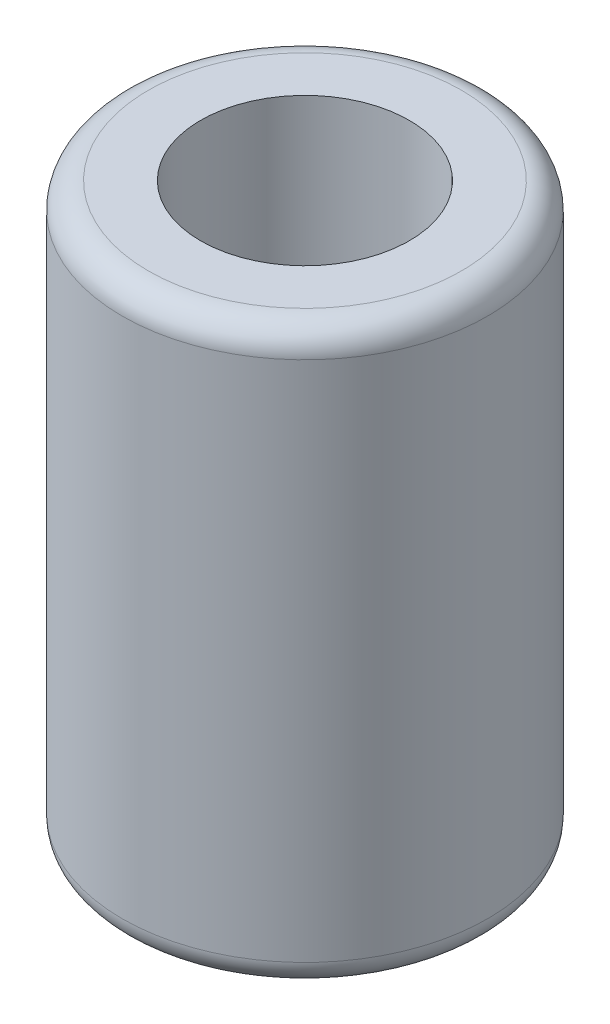
ISO-10303-21;
HEADER;
FILE_DESCRIPTION(('STEP AP214'),'2;1');
FILE_NAME('part.step','',(''),(''),'','','');
FILE_SCHEMA(('AUTOMOTIVE_DESIGN { 1 0 10303 214 1 1 1 1 }'));
ENDSEC;
DATA;
#1=APPLICATION_CONTEXT('core data for automotive mechanical design processes');
#2=APPLICATION_PROTOCOL_DEFINITION('international standard','automotive_design',2000,#1);
#3=PRODUCT_CONTEXT('',#1,'mechanical');
#4=PRODUCT('Part','Part','',(#3));
#5=PRODUCT_RELATED_PRODUCT_CATEGORY('part','',(#4));
#6=PRODUCT_DEFINITION_FORMATION('','',#4);
#7=PRODUCT_DEFINITION_CONTEXT('part definition',#1,'design');
#8=PRODUCT_DEFINITION('design','',#6,#7);
#9=PRODUCT_DEFINITION_SHAPE('','',#8);
#10=(LENGTH_UNIT() NAMED_UNIT(*) SI_UNIT(.MILLI.,.METRE.));
#11=(NAMED_UNIT(*) PLANE_ANGLE_UNIT() SI_UNIT($,.RADIAN.));
#12=(NAMED_UNIT(*) SI_UNIT($,.STERADIAN.) SOLID_ANGLE_UNIT());
#13=UNCERTAINTY_MEASURE_WITH_UNIT(LENGTH_MEASURE(1.E-05),#10,'distance_accuracy_value','');
#14=(GEOMETRIC_REPRESENTATION_CONTEXT(3) GLOBAL_UNCERTAINTY_ASSIGNED_CONTEXT((#13)) GLOBAL_UNIT_ASSIGNED_CONTEXT((#10,
#11,#12)) REPRESENTATION_CONTEXT('',''));
#15=CARTESIAN_POINT('',(0.,0.,0.));
#16=DIRECTION('',(0.,0.,1.));
#17=DIRECTION('',(1.,0.,0.));
#18=AXIS2_PLACEMENT_3D('',#15,#16,#17);
#19=CARTESIAN_POINT('',(0.,22.,0.));
#20=DIRECTION('',(0.,-1.,0.));
#21=DIRECTION('',(0.,0.,-1.));
#22=AXIS2_PLACEMENT_3D('',#19,#20,#21);
#23=CYLINDRICAL_SURFACE('',#22,7.);
#24=CARTESIAN_POINT('',(0.,1.,0.));
#25=DIRECTION('',(0.,1.,0.));
#26=DIRECTION('',(0.,0.,1.));
#27=AXIS2_PLACEMENT_3D('',#24,#25,#26);
#28=CIRCLE('',#27,7.);
#29=CARTESIAN_POINT('',(0.,1.,7.));
#30=VERTEX_POINT('',#29);
#31=EDGE_CURVE('E45',#30,#30,#28,.T.);
#32=ORIENTED_EDGE('',*,*,#31,.T.);
#33=EDGE_LOOP('',(#32));
#34=FACE_BOUND('',#33,.T.);
#35=CARTESIAN_POINT('',(0.,21.,0.));
#36=DIRECTION('',(0.,1.,0.));
#37=DIRECTION('',(0.,0.,1.));
#38=AXIS2_PLACEMENT_3D('',#35,#36,#37);
#39=CIRCLE('',#38,7.);
#40=CARTESIAN_POINT('',(0.,21.,7.));
#41=VERTEX_POINT('',#40);
#42=EDGE_CURVE('E50',#41,#41,#39,.F.);
#43=ORIENTED_EDGE('',*,*,#42,.T.);
#44=EDGE_LOOP('',(#43));
#45=FACE_BOUND('',#44,.T.);
#46=ADVANCED_FACE('F37',(#34,#45),#23,.T.);
#47=CARTESIAN_POINT('',(0.,22.,0.));
#48=DIRECTION('',(0.,1.,0.));
#49=DIRECTION('',(0.,0.,1.));
#50=AXIS2_PLACEMENT_3D('',#47,#48,#49);
#51=PLANE('',#50);
#52=CARTESIAN_POINT('',(0.,22.,0.));
#53=DIRECTION('',(0.,1.,0.));
#54=DIRECTION('',(0.,0.,1.));
#55=AXIS2_PLACEMENT_3D('',#52,#53,#54);
#56=CIRCLE('',#55,6.);
#57=CARTESIAN_POINT('',(0.,22.,6.));
#58=VERTEX_POINT('',#57);
#59=EDGE_CURVE('E55',#58,#58,#56,.T.);
#60=ORIENTED_EDGE('',*,*,#59,.T.);
#61=EDGE_LOOP('',(#60));
#62=FACE_BOUND('',#61,.T.);
#63=CARTESIAN_POINT('',(0.,22.,0.));
#64=DIRECTION('',(0.,1.,0.));
#65=DIRECTION('',(0.,0.,1.));
#66=AXIS2_PLACEMENT_3D('',#63,#64,#65);
#67=CIRCLE('',#66,4.);
#68=CARTESIAN_POINT('',(0.,22.,4.));
#69=VERTEX_POINT('',#68);
#70=EDGE_CURVE('E62',#69,#69,#67,.T.);
#71=ORIENTED_EDGE('',*,*,#70,.F.);
#72=EDGE_LOOP('',(#71));
#73=FACE_BOUND('',#72,.T.);
#74=ADVANCED_FACE('F79',(#62,#73),#51,.T.);
#75=CARTESIAN_POINT('',(0.,0.,0.));
#76=DIRECTION('',(0.,1.,0.));
#77=DIRECTION('',(0.,0.,1.));
#78=AXIS2_PLACEMENT_3D('',#75,#76,#77);
#79=PLANE('',#78);
#80=CARTESIAN_POINT('',(0.,0.,0.));
#81=DIRECTION('',(0.,1.,0.));
#82=DIRECTION('',(0.,0.,1.));
#83=AXIS2_PLACEMENT_3D('',#80,#81,#82);
#84=CIRCLE('',#83,6.);
#85=CARTESIAN_POINT('',(0.,0.,6.));
#86=VERTEX_POINT('',#85);
#87=EDGE_CURVE('E10',#86,#86,#84,.F.);
#88=ORIENTED_EDGE('',*,*,#87,.T.);
#89=EDGE_LOOP('',(#88));
#90=FACE_BOUND('',#89,.T.);
#91=CARTESIAN_POINT('',(0.,0.,0.));
#92=DIRECTION('',(0.,1.,0.));
#93=DIRECTION('',(0.,0.,1.));
#94=AXIS2_PLACEMENT_3D('',#91,#92,#93);
#95=CIRCLE('',#94,4.);
#96=CARTESIAN_POINT('',(0.,0.,4.));
#97=VERTEX_POINT('',#96);
#98=EDGE_CURVE('E61',#97,#97,#95,.T.);
#99=ORIENTED_EDGE('',*,*,#98,.T.);
#100=EDGE_LOOP('',(#99));
#101=FACE_BOUND('',#100,.T.);
#102=ADVANCED_FACE('F70',(#90,#101),#79,.F.);
#103=CARTESIAN_POINT('',(0.,0.,0.));
#104=DIRECTION('',(0.,1.,0.));
#105=DIRECTION('',(0.,0.,1.));
#106=AXIS2_PLACEMENT_3D('',#103,#104,#105);
#107=CYLINDRICAL_SURFACE('',#106,4.);
#108=ORIENTED_EDGE('',*,*,#98,.F.);
#109=EDGE_LOOP('',(#108));
#110=FACE_BOUND('',#109,.T.);
#111=ORIENTED_EDGE('',*,*,#70,.T.);
#112=EDGE_LOOP('',(#111));
#113=FACE_BOUND('',#112,.T.);
#114=ADVANCED_FACE('F72',(#110,#113),#107,.F.);
#115=CARTESIAN_POINT('',(0.,21.,0.));
#116=DIRECTION('',(0.,1.,0.));
#117=DIRECTION('',(0.,0.,1.));
#118=AXIS2_PLACEMENT_3D('',#115,#116,#117);
#119=TOROIDAL_SURFACE('',#118,6.,1.);
#120=ORIENTED_EDGE('',*,*,#42,.F.);
#121=EDGE_LOOP('',(#120));
#122=FACE_BOUND('',#121,.T.);
#123=ORIENTED_EDGE('',*,*,#59,.F.);
#124=EDGE_LOOP('',(#123));
#125=FACE_BOUND('',#124,.T.);
#126=ADVANCED_FACE('F75',(#122,#125),#119,.T.);
#127=CARTESIAN_POINT('',(0.,1.,0.));
#128=DIRECTION('',(0.,1.,0.));
#129=DIRECTION('',(0.,0.,1.));
#130=AXIS2_PLACEMENT_3D('',#127,#128,#129);
#131=TOROIDAL_SURFACE('',#130,6.,1.);
#132=ORIENTED_EDGE('',*,*,#87,.F.);
#133=EDGE_LOOP('',(#132));
#134=FACE_BOUND('',#133,.T.);
#135=ORIENTED_EDGE('',*,*,#31,.F.);
#136=EDGE_LOOP('',(#135));
#137=FACE_BOUND('',#136,.T.);
#138=ADVANCED_FACE('F39',(#134,#137),#131,.T.);
#139=CLOSED_SHELL('',(#46,#74,#102,#114,#126,#138));
#140=MANIFOLD_SOLID_BREP('B2',#139);
#141=ADVANCED_BREP_SHAPE_REPRESENTATION('',(#18,#140),#14);
#142=SHAPE_DEFINITION_REPRESENTATION(#9,#141);
ENDSEC;
END-ISO-10303-21;
